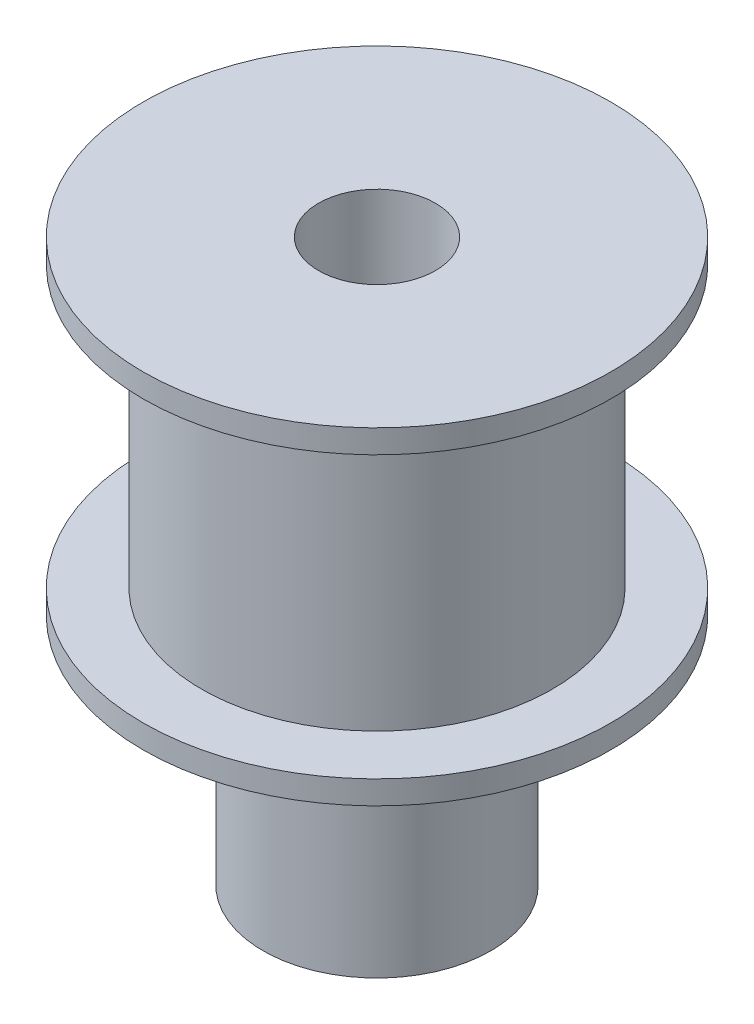
ISO-10303-21;
HEADER;
FILE_DESCRIPTION(('STEP AP214'),'2;1');
FILE_NAME('part.step','',(''),(''),'','','');
FILE_SCHEMA(('AUTOMOTIVE_DESIGN { 1 0 10303 214 1 1 1 1 }'));
ENDSEC;
DATA;
#1=APPLICATION_CONTEXT('core data for automotive mechanical design processes');
#2=APPLICATION_PROTOCOL_DEFINITION('international standard','automotive_design',2000,#1);
#3=PRODUCT_CONTEXT('',#1,'mechanical');
#4=PRODUCT('Part','Part','',(#3));
#5=PRODUCT_RELATED_PRODUCT_CATEGORY('part','',(#4));
#6=PRODUCT_DEFINITION_FORMATION('','',#4);
#7=PRODUCT_DEFINITION_CONTEXT('part definition',#1,'design');
#8=PRODUCT_DEFINITION('design','',#6,#7);
#9=PRODUCT_DEFINITION_SHAPE('','',#8);
#10=(LENGTH_UNIT() NAMED_UNIT(*) SI_UNIT(.MILLI.,.METRE.));
#11=(NAMED_UNIT(*) PLANE_ANGLE_UNIT() SI_UNIT($,.RADIAN.));
#12=(NAMED_UNIT(*) SI_UNIT($,.STERADIAN.) SOLID_ANGLE_UNIT());
#13=UNCERTAINTY_MEASURE_WITH_UNIT(LENGTH_MEASURE(1.E-05),#10,'distance_accuracy_value','');
#14=(GEOMETRIC_REPRESENTATION_CONTEXT(3) GLOBAL_UNCERTAINTY_ASSIGNED_CONTEXT((#13)) GLOBAL_UNIT_ASSIGNED_CONTEXT((#10,
#11,#12)) REPRESENTATION_CONTEXT('',''));
#15=CARTESIAN_POINT('',(0.,0.,0.));
#16=DIRECTION('',(0.,0.,1.));
#17=DIRECTION('',(1.,0.,0.));
#18=AXIS2_PLACEMENT_3D('',#15,#16,#17);
#19=CARTESIAN_POINT('',(-4.875,0.,0.));
#20=DIRECTION('',(0.,1.,0.));
#21=DIRECTION('',(0.,0.,1.));
#22=AXIS2_PLACEMENT_3D('',#19,#20,#21);
#23=PLANE('',#22);
#24=CARTESIAN_POINT('',(0.,0.,0.));
#25=DIRECTION('',(0.,-1.,0.));
#26=DIRECTION('',(0.,0.,-1.));
#27=AXIS2_PLACEMENT_3D('',#24,#25,#26);
#28=CIRCLE('',#27,2.5);
#29=CARTESIAN_POINT('',(0.,0.,-2.5));
#30=VERTEX_POINT('',#29);
#31=EDGE_CURVE('E10',#30,#30,#28,.T.);
#32=ORIENTED_EDGE('',*,*,#31,.F.);
#33=EDGE_LOOP('',(#32));
#34=FACE_BOUND('',#33,.T.);
#35=CARTESIAN_POINT('',(0.,0.,0.));
#36=DIRECTION('',(0.,-1.,0.));
#37=DIRECTION('',(0.,0.,-1.));
#38=AXIS2_PLACEMENT_3D('',#35,#36,#37);
#39=CIRCLE('',#38,4.875);
#40=CARTESIAN_POINT('',(0.,0.,-4.875));
#41=VERTEX_POINT('',#40);
#42=EDGE_CURVE('E64',#41,#41,#39,.T.);
#43=ORIENTED_EDGE('',*,*,#42,.T.);
#44=EDGE_LOOP('',(#43));
#45=FACE_BOUND('',#44,.T.);
#46=ADVANCED_FACE('F30',(#34,#45),#23,.F.);
#47=CARTESIAN_POINT('',(0.,0.,0.));
#48=DIRECTION('',(0.,-1.,0.));
#49=DIRECTION('',(0.,0.,-1.));
#50=AXIS2_PLACEMENT_3D('',#47,#48,#49);
#51=CYLINDRICAL_SURFACE('',#50,2.5);
#52=CARTESIAN_POINT('',(0.,24.,0.));
#53=DIRECTION('',(0.,-1.,0.));
#54=DIRECTION('',(0.,0.,-1.));
#55=AXIS2_PLACEMENT_3D('',#52,#53,#54);
#56=CIRCLE('',#55,2.5);
#57=CARTESIAN_POINT('',(0.,24.,-2.5));
#58=VERTEX_POINT('',#57);
#59=EDGE_CURVE('E36',#58,#58,#56,.T.);
#60=ORIENTED_EDGE('',*,*,#59,.F.);
#61=EDGE_LOOP('',(#60));
#62=FACE_BOUND('',#61,.T.);
#63=ORIENTED_EDGE('',*,*,#31,.T.);
#64=EDGE_LOOP('',(#63));
#65=FACE_BOUND('',#64,.T.);
#66=ADVANCED_FACE('F113',(#62,#65),#51,.F.);
#67=CARTESIAN_POINT('',(-2.5,24.,0.));
#68=DIRECTION('',(0.,-1.,0.));
#69=DIRECTION('',(0.,0.,-1.));
#70=AXIS2_PLACEMENT_3D('',#67,#68,#69);
#71=PLANE('',#70);
#72=CARTESIAN_POINT('',(0.,24.,0.));
#73=DIRECTION('',(0.,-1.,0.));
#74=DIRECTION('',(0.,0.,-1.));
#75=AXIS2_PLACEMENT_3D('',#72,#73,#74);
#76=CIRCLE('',#75,10.);
#77=CARTESIAN_POINT('',(0.,24.,-10.));
#78=VERTEX_POINT('',#77);
#79=EDGE_CURVE('E40',#78,#78,#76,.T.);
#80=ORIENTED_EDGE('',*,*,#79,.F.);
#81=EDGE_LOOP('',(#80));
#82=FACE_BOUND('',#81,.T.);
#83=ORIENTED_EDGE('',*,*,#59,.T.);
#84=EDGE_LOOP('',(#83));
#85=FACE_BOUND('',#84,.T.);
#86=ADVANCED_FACE('F108',(#82,#85),#71,.F.);
#87=CARTESIAN_POINT('',(0.,0.,0.));
#88=DIRECTION('',(0.,-1.,0.));
#89=DIRECTION('',(0.,0.,-1.));
#90=AXIS2_PLACEMENT_3D('',#87,#88,#89);
#91=CYLINDRICAL_SURFACE('',#90,10.);
#92=CARTESIAN_POINT('',(0.,23.,0.));
#93=DIRECTION('',(0.,-1.,0.));
#94=DIRECTION('',(0.,0.,-1.));
#95=AXIS2_PLACEMENT_3D('',#92,#93,#94);
#96=CIRCLE('',#95,10.);
#97=CARTESIAN_POINT('',(0.,23.,-10.));
#98=VERTEX_POINT('',#97);
#99=EDGE_CURVE('E44',#98,#98,#96,.T.);
#100=ORIENTED_EDGE('',*,*,#99,.F.);
#101=EDGE_LOOP('',(#100));
#102=FACE_BOUND('',#101,.T.);
#103=ORIENTED_EDGE('',*,*,#79,.T.);
#104=EDGE_LOOP('',(#103));
#105=FACE_BOUND('',#104,.T.);
#106=ADVANCED_FACE('F102',(#102,#105),#91,.T.);
#107=CARTESIAN_POINT('',(-10.,23.,0.));
#108=DIRECTION('',(0.,1.,0.));
#109=DIRECTION('',(0.,0.,1.));
#110=AXIS2_PLACEMENT_3D('',#107,#108,#109);
#111=PLANE('',#110);
#112=CARTESIAN_POINT('',(0.,23.,0.));
#113=DIRECTION('',(0.,-1.,0.));
#114=DIRECTION('',(0.,0.,-1.));
#115=AXIS2_PLACEMENT_3D('',#112,#113,#114);
#116=CIRCLE('',#115,7.5);
#117=CARTESIAN_POINT('',(0.,23.,-7.5));
#118=VERTEX_POINT('',#117);
#119=EDGE_CURVE('E49',#118,#118,#116,.T.);
#120=ORIENTED_EDGE('',*,*,#119,.F.);
#121=EDGE_LOOP('',(#120));
#122=FACE_BOUND('',#121,.T.);
#123=ORIENTED_EDGE('',*,*,#99,.T.);
#124=EDGE_LOOP('',(#123));
#125=FACE_BOUND('',#124,.T.);
#126=ADVANCED_FACE('F96',(#122,#125),#111,.F.);
#127=CARTESIAN_POINT('',(0.,0.,0.));
#128=DIRECTION('',(0.,-1.,0.));
#129=DIRECTION('',(0.,0.,-1.));
#130=AXIS2_PLACEMENT_3D('',#127,#128,#129);
#131=CYLINDRICAL_SURFACE('',#130,7.5);
#132=CARTESIAN_POINT('',(0.,11.,0.));
#133=DIRECTION('',(0.,-1.,0.));
#134=DIRECTION('',(0.,0.,-1.));
#135=AXIS2_PLACEMENT_3D('',#132,#133,#134);
#136=CIRCLE('',#135,7.5);
#137=CARTESIAN_POINT('',(0.,11.,-7.5));
#138=VERTEX_POINT('',#137);
#139=EDGE_CURVE('E52',#138,#138,#136,.T.);
#140=ORIENTED_EDGE('',*,*,#139,.F.);
#141=EDGE_LOOP('',(#140));
#142=FACE_BOUND('',#141,.T.);
#143=ORIENTED_EDGE('',*,*,#119,.T.);
#144=EDGE_LOOP('',(#143));
#145=FACE_BOUND('',#144,.T.);
#146=ADVANCED_FACE('F90',(#142,#145),#131,.T.);
#147=CARTESIAN_POINT('',(-7.5,11.,0.));
#148=DIRECTION('',(0.,-1.,0.));
#149=DIRECTION('',(0.,0.,-1.));
#150=AXIS2_PLACEMENT_3D('',#147,#148,#149);
#151=PLANE('',#150);
#152=CARTESIAN_POINT('',(0.,11.,0.));
#153=DIRECTION('',(0.,-1.,0.));
#154=DIRECTION('',(0.,0.,-1.));
#155=AXIS2_PLACEMENT_3D('',#152,#153,#154);
#156=CIRCLE('',#155,10.);
#157=CARTESIAN_POINT('',(0.,11.,-10.));
#158=VERTEX_POINT('',#157);
#159=EDGE_CURVE('E55',#158,#158,#156,.T.);
#160=ORIENTED_EDGE('',*,*,#159,.F.);
#161=EDGE_LOOP('',(#160));
#162=FACE_BOUND('',#161,.T.);
#163=ORIENTED_EDGE('',*,*,#139,.T.);
#164=EDGE_LOOP('',(#163));
#165=FACE_BOUND('',#164,.T.);
#166=ADVANCED_FACE('F84',(#162,#165),#151,.F.);
#167=CARTESIAN_POINT('',(0.,0.,0.));
#168=DIRECTION('',(0.,-1.,0.));
#169=DIRECTION('',(0.,0.,-1.));
#170=AXIS2_PLACEMENT_3D('',#167,#168,#169);
#171=CYLINDRICAL_SURFACE('',#170,10.);
#172=CARTESIAN_POINT('',(0.,10.,0.));
#173=DIRECTION('',(0.,-1.,0.));
#174=DIRECTION('',(0.,0.,-1.));
#175=AXIS2_PLACEMENT_3D('',#172,#173,#174);
#176=CIRCLE('',#175,10.);
#177=CARTESIAN_POINT('',(0.,10.,-10.));
#178=VERTEX_POINT('',#177);
#179=EDGE_CURVE('E58',#178,#178,#176,.T.);
#180=ORIENTED_EDGE('',*,*,#179,.F.);
#181=EDGE_LOOP('',(#180));
#182=FACE_BOUND('',#181,.T.);
#183=ORIENTED_EDGE('',*,*,#159,.T.);
#184=EDGE_LOOP('',(#183));
#185=FACE_BOUND('',#184,.T.);
#186=ADVANCED_FACE('F78',(#182,#185),#171,.T.);
#187=CARTESIAN_POINT('',(-10.,10.,0.));
#188=DIRECTION('',(0.,1.,0.));
#189=DIRECTION('',(0.,0.,1.));
#190=AXIS2_PLACEMENT_3D('',#187,#188,#189);
#191=PLANE('',#190);
#192=CARTESIAN_POINT('',(0.,10.,0.));
#193=DIRECTION('',(0.,-1.,0.));
#194=DIRECTION('',(0.,0.,-1.));
#195=AXIS2_PLACEMENT_3D('',#192,#193,#194);
#196=CIRCLE('',#195,4.875);
#197=CARTESIAN_POINT('',(0.,10.,-4.875));
#198=VERTEX_POINT('',#197);
#199=EDGE_CURVE('E61',#198,#198,#196,.T.);
#200=ORIENTED_EDGE('',*,*,#199,.F.);
#201=EDGE_LOOP('',(#200));
#202=FACE_BOUND('',#201,.T.);
#203=ORIENTED_EDGE('',*,*,#179,.T.);
#204=EDGE_LOOP('',(#203));
#205=FACE_BOUND('',#204,.T.);
#206=ADVANCED_FACE('F72',(#202,#205),#191,.F.);
#207=CARTESIAN_POINT('',(0.,0.,0.));
#208=DIRECTION('',(0.,-1.,0.));
#209=DIRECTION('',(0.,0.,-1.));
#210=AXIS2_PLACEMENT_3D('',#207,#208,#209);
#211=CYLINDRICAL_SURFACE('',#210,4.875);
#212=ORIENTED_EDGE('',*,*,#42,.F.);
#213=EDGE_LOOP('',(#212));
#214=FACE_BOUND('',#213,.T.);
#215=ORIENTED_EDGE('',*,*,#199,.T.);
#216=EDGE_LOOP('',(#215));
#217=FACE_BOUND('',#216,.T.);
#218=ADVANCED_FACE('F69',(#214,#217),#211,.T.);
#219=CLOSED_SHELL('',(#46,#66,#86,#106,#126,#146,#166,#186,#206,#218));
#220=MANIFOLD_SOLID_BREP('B2',#219);
#221=ADVANCED_BREP_SHAPE_REPRESENTATION('',(#18,#220),#14);
#222=SHAPE_DEFINITION_REPRESENTATION(#9,#221);
ENDSEC;
END-ISO-10303-21;
